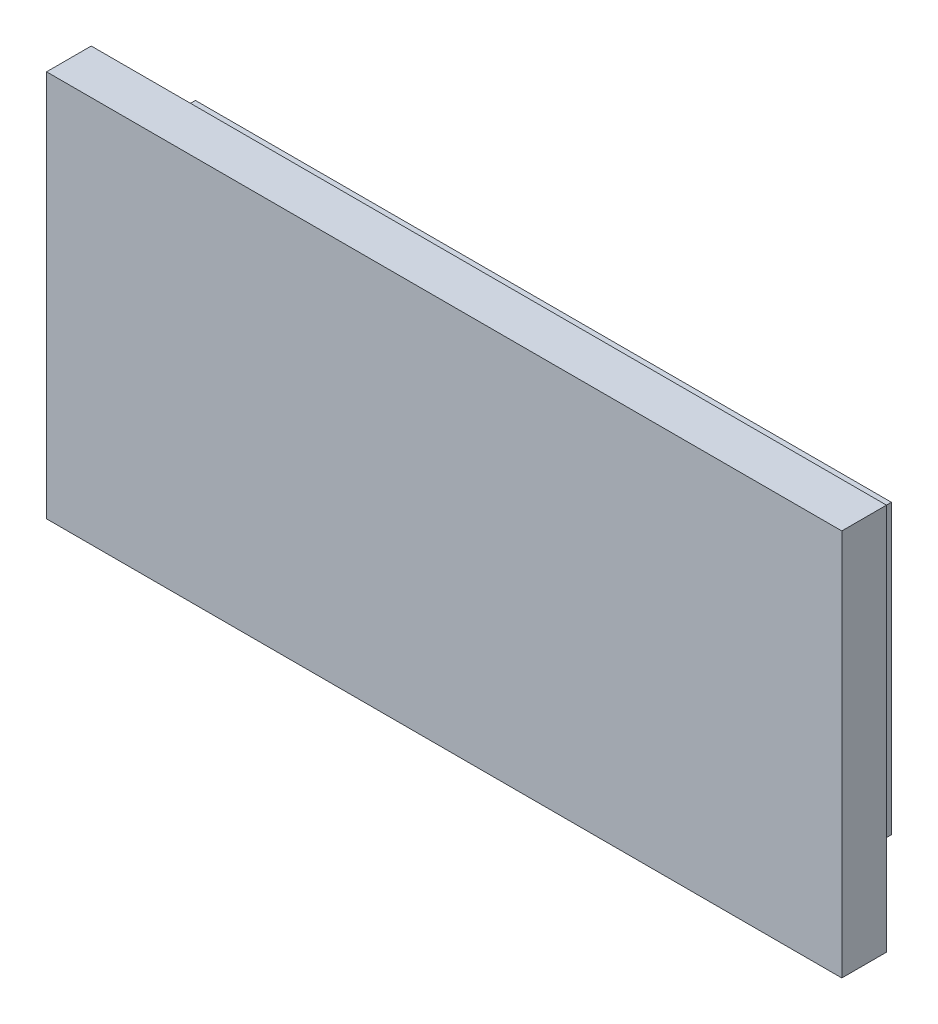
ISO-10303-21;
HEADER;
FILE_DESCRIPTION(('STEP AP214'),'2;1');
FILE_NAME('part.step','',(''),(''),'','','');
FILE_SCHEMA(('AUTOMOTIVE_DESIGN { 1 0 10303 214 1 1 1 1 }'));
ENDSEC;
DATA;
#1=APPLICATION_CONTEXT('core data for automotive mechanical design processes');
#2=APPLICATION_PROTOCOL_DEFINITION('international standard','automotive_design',2000,#1);
#3=PRODUCT_CONTEXT('',#1,'mechanical');
#4=PRODUCT('Part','Part','',(#3));
#5=PRODUCT_RELATED_PRODUCT_CATEGORY('part','',(#4));
#6=PRODUCT_DEFINITION_FORMATION('','',#4);
#7=PRODUCT_DEFINITION_CONTEXT('part definition',#1,'design');
#8=PRODUCT_DEFINITION('design','',#6,#7);
#9=PRODUCT_DEFINITION_SHAPE('','',#8);
#10=(LENGTH_UNIT() NAMED_UNIT(*) SI_UNIT(.MILLI.,.METRE.));
#11=(NAMED_UNIT(*) PLANE_ANGLE_UNIT() SI_UNIT($,.RADIAN.));
#12=(NAMED_UNIT(*) SI_UNIT($,.STERADIAN.) SOLID_ANGLE_UNIT());
#13=UNCERTAINTY_MEASURE_WITH_UNIT(LENGTH_MEASURE(1.E-05),#10,'distance_accuracy_value','');
#14=(GEOMETRIC_REPRESENTATION_CONTEXT(3) GLOBAL_UNCERTAINTY_ASSIGNED_CONTEXT((#13)) GLOBAL_UNIT_ASSIGNED_CONTEXT((#10,
#11,#12)) REPRESENTATION_CONTEXT('',''));
#15=CARTESIAN_POINT('',(0.,0.,0.));
#16=DIRECTION('',(0.,0.,1.));
#17=DIRECTION('',(1.,0.,0.));
#18=AXIS2_PLACEMENT_3D('',#15,#16,#17);
#19=CARTESIAN_POINT('',(-105.3879,0.,-0.9));
#20=DIRECTION('',(-1.,0.,0.));
#21=DIRECTION('',(0.,0.,1.));
#22=AXIS2_PLACEMENT_3D('',#19,#20,#21);
#23=PLANE('',#22);
#24=DIRECTION('',(0.,-1.,0.));
#25=VECTOR('',#24,1.);
#26=CARTESIAN_POINT('',(-105.3879,0.,0.));
#27=LINE('',#26,#25);
#28=CARTESIAN_POINT('',(-105.3879,-96.2518,0.));
#29=VERTEX_POINT('',#28);
#30=CARTESIAN_POINT('',(-105.3879,-104.0518,0.));
#31=VERTEX_POINT('',#30);
#32=EDGE_CURVE('E129',#29,#31,#27,.T.);
#33=ORIENTED_EDGE('',*,*,#32,.T.);
#34=DIRECTION('',(0.,0.,1.));
#35=VECTOR('',#34,1.);
#36=CARTESIAN_POINT('',(-105.3879,-104.0518,-0.9));
#37=LINE('',#36,#35);
#38=CARTESIAN_POINT('',(-105.3879,-104.0518,-0.9));
#39=VERTEX_POINT('',#38);
#40=EDGE_CURVE('E12',#39,#31,#37,.T.);
#41=ORIENTED_EDGE('',*,*,#40,.F.);
#42=DIRECTION('',(0.,-1.,0.));
#43=VECTOR('',#42,1.);
#44=CARTESIAN_POINT('',(-105.3879,0.,-0.9));
#45=LINE('',#44,#43);
#46=CARTESIAN_POINT('',(-105.3879,-96.2518,-0.9));
#47=VERTEX_POINT('',#46);
#48=EDGE_CURVE('E131',#47,#39,#45,.T.);
#49=ORIENTED_EDGE('',*,*,#48,.F.);
#50=DIRECTION('',(0.,0.,1.));
#51=VECTOR('',#50,1.);
#52=CARTESIAN_POINT('',(-105.3879,-96.2518,-0.9));
#53=LINE('',#52,#51);
#54=EDGE_CURVE('E39',#47,#29,#53,.T.);
#55=ORIENTED_EDGE('',*,*,#54,.T.);
#56=EDGE_LOOP('',(#33,#41,#49,#55));
#57=FACE_BOUND('',#56,.T.);
#58=ADVANCED_FACE('F36',(#57),#23,.F.);
#59=CARTESIAN_POINT('',(0.,-104.0518,-0.9));
#60=DIRECTION('',(0.,-1.,0.));
#61=DIRECTION('',(0.,0.,-1.));
#62=AXIS2_PLACEMENT_3D('',#59,#60,#61);
#63=PLANE('',#62);
#64=DIRECTION('',(1.,0.,0.));
#65=VECTOR('',#64,1.);
#66=CARTESIAN_POINT('',(0.,-104.0518,0.));
#67=LINE('',#66,#65);
#68=CARTESIAN_POINT('',(-121.4087,-104.0518,0.));
#69=VERTEX_POINT('',#68);
#70=EDGE_CURVE('E134',#69,#31,#67,.T.);
#71=ORIENTED_EDGE('',*,*,#70,.F.);
#72=DIRECTION('',(0.,0.,1.));
#73=VECTOR('',#72,1.);
#74=CARTESIAN_POINT('',(-121.4087,-104.0518,-0.9));
#75=LINE('',#74,#73);
#76=CARTESIAN_POINT('',(-121.4087,-104.0518,-0.9));
#77=VERTEX_POINT('',#76);
#78=EDGE_CURVE('E44',#77,#69,#75,.T.);
#79=ORIENTED_EDGE('',*,*,#78,.F.);
#80=DIRECTION('',(1.,0.,0.));
#81=VECTOR('',#80,1.);
#82=CARTESIAN_POINT('',(0.,-104.0518,-0.9));
#83=LINE('',#82,#81);
#84=EDGE_CURVE('E139',#77,#39,#83,.T.);
#85=ORIENTED_EDGE('',*,*,#84,.T.);
#86=ORIENTED_EDGE('',*,*,#40,.T.);
#87=EDGE_LOOP('',(#71,#79,#85,#86));
#88=FACE_BOUND('',#87,.T.);
#89=ADVANCED_FACE('F166',(#88),#63,.T.);
#90=CARTESIAN_POINT('',(-121.4087,0.,-0.9));
#91=DIRECTION('',(-1.,0.,0.));
#92=DIRECTION('',(0.,0.,1.));
#93=AXIS2_PLACEMENT_3D('',#90,#91,#92);
#94=PLANE('',#93);
#95=DIRECTION('',(0.,-1.,0.));
#96=VECTOR('',#95,1.);
#97=CARTESIAN_POINT('',(-121.4087,0.,0.));
#98=LINE('',#97,#96);
#99=CARTESIAN_POINT('',(-121.4087,-96.2518,0.));
#100=VERTEX_POINT('',#99);
#101=EDGE_CURVE('E146',#100,#69,#98,.T.);
#102=ORIENTED_EDGE('',*,*,#101,.F.);
#103=DIRECTION('',(0.,0.,1.));
#104=VECTOR('',#103,1.);
#105=CARTESIAN_POINT('',(-121.4087,-96.2518,-0.9));
#106=LINE('',#105,#104);
#107=CARTESIAN_POINT('',(-121.4087,-96.2518,-0.9));
#108=VERTEX_POINT('',#107);
#109=EDGE_CURVE('E151',#108,#100,#106,.T.);
#110=ORIENTED_EDGE('',*,*,#109,.F.);
#111=DIRECTION('',(0.,-1.,0.));
#112=VECTOR('',#111,1.);
#113=CARTESIAN_POINT('',(-121.4087,0.,-0.9));
#114=LINE('',#113,#112);
#115=EDGE_CURVE('E136',#108,#77,#114,.T.);
#116=ORIENTED_EDGE('',*,*,#115,.T.);
#117=ORIENTED_EDGE('',*,*,#78,.T.);
#118=EDGE_LOOP('',(#102,#110,#116,#117));
#119=FACE_BOUND('',#118,.T.);
#120=ADVANCED_FACE('F171',(#119),#94,.T.);
#121=CARTESIAN_POINT('',(0.,-96.2518,-0.9));
#122=DIRECTION('',(0.,-1.,0.));
#123=DIRECTION('',(0.,0.,-1.));
#124=AXIS2_PLACEMENT_3D('',#121,#122,#123);
#125=PLANE('',#124);
#126=DIRECTION('',(1.,0.,0.));
#127=VECTOR('',#126,1.);
#128=CARTESIAN_POINT('',(0.,-96.2518,0.));
#129=LINE('',#128,#127);
#130=EDGE_CURVE('E144',#100,#29,#129,.T.);
#131=ORIENTED_EDGE('',*,*,#130,.T.);
#132=ORIENTED_EDGE('',*,*,#54,.F.);
#133=DIRECTION('',(1.,0.,0.));
#134=VECTOR('',#133,1.);
#135=CARTESIAN_POINT('',(0.,-96.2518,-0.9));
#136=LINE('',#135,#134);
#137=EDGE_CURVE('E133',#108,#47,#136,.T.);
#138=ORIENTED_EDGE('',*,*,#137,.F.);
#139=ORIENTED_EDGE('',*,*,#109,.T.);
#140=EDGE_LOOP('',(#131,#132,#138,#139));
#141=FACE_BOUND('',#140,.T.);
#142=ADVANCED_FACE('F169',(#141),#125,.F.);
#143=CARTESIAN_POINT('',(0.,0.,-0.9));
#144=DIRECTION('',(0.,0.,1.));
#145=DIRECTION('',(1.,0.,0.));
#146=AXIS2_PLACEMENT_3D('',#143,#144,#145);
#147=PLANE('',#146);
#148=DIRECTION('',(1.,0.,0.));
#149=VECTOR('',#148,1.);
#150=CARTESIAN_POINT('',(0.,-97.2518,-0.9));
#151=LINE('',#150,#149);
#152=CARTESIAN_POINT('',(-120.4087,-97.2518,-0.9));
#153=VERTEX_POINT('',#152);
#154=CARTESIAN_POINT('',(-106.3879,-97.2518,-0.9));
#155=VERTEX_POINT('',#154);
#156=EDGE_CURVE('E103',#153,#155,#151,.T.);
#157=ORIENTED_EDGE('',*,*,#156,.F.);
#158=DIRECTION('',(0.,-1.,0.));
#159=VECTOR('',#158,1.);
#160=CARTESIAN_POINT('',(-120.4087,0.,-0.9));
#161=LINE('',#160,#159);
#162=CARTESIAN_POINT('',(-120.4087,-103.0518,-0.9));
#163=VERTEX_POINT('',#162);
#164=EDGE_CURVE('E52',#153,#163,#161,.T.);
#165=ORIENTED_EDGE('',*,*,#164,.T.);
#166=DIRECTION('',(1.,0.,0.));
#167=VECTOR('',#166,1.);
#168=CARTESIAN_POINT('',(0.,-103.0518,-0.9));
#169=LINE('',#168,#167);
#170=CARTESIAN_POINT('',(-106.3879,-103.0518,-0.9));
#171=VERTEX_POINT('',#170);
#172=EDGE_CURVE('E57',#163,#171,#169,.T.);
#173=ORIENTED_EDGE('',*,*,#172,.T.);
#174=DIRECTION('',(0.,-1.,0.));
#175=VECTOR('',#174,1.);
#176=CARTESIAN_POINT('',(-106.3879,0.,-0.9));
#177=LINE('',#176,#175);
#178=EDGE_CURVE('E98',#155,#171,#177,.T.);
#179=ORIENTED_EDGE('',*,*,#178,.F.);
#180=EDGE_LOOP('',(#157,#165,#173,#179));
#181=FACE_BOUND('',#180,.T.);
#182=ORIENTED_EDGE('',*,*,#48,.T.);
#183=ORIENTED_EDGE('',*,*,#84,.F.);
#184=ORIENTED_EDGE('',*,*,#115,.F.);
#185=ORIENTED_EDGE('',*,*,#137,.T.);
#186=EDGE_LOOP('',(#182,#183,#184,#185));
#187=FACE_BOUND('',#186,.T.);
#188=ADVANCED_FACE('F100',(#181,#187),#147,.F.);
#189=CARTESIAN_POINT('',(0.,0.,0.));
#190=DIRECTION('',(0.,0.,1.));
#191=DIRECTION('',(1.,0.,0.));
#192=AXIS2_PLACEMENT_3D('',#189,#190,#191);
#193=PLANE('',#192);
#194=ORIENTED_EDGE('',*,*,#32,.F.);
#195=ORIENTED_EDGE('',*,*,#130,.F.);
#196=ORIENTED_EDGE('',*,*,#101,.T.);
#197=ORIENTED_EDGE('',*,*,#70,.T.);
#198=EDGE_LOOP('',(#194,#195,#196,#197));
#199=FACE_BOUND('',#198,.T.);
#200=ADVANCED_FACE('F162',(#199),#193,.T.);
#201=CARTESIAN_POINT('',(-120.4087,0.,-27.1730956841377));
#202=DIRECTION('',(-1.,0.,0.));
#203=DIRECTION('',(0.,0.,1.));
#204=AXIS2_PLACEMENT_3D('',#201,#202,#203);
#205=PLANE('',#204);
#206=DIRECTION('',(0.,1.,0.));
#207=VECTOR('',#206,1.);
#208=CARTESIAN_POINT('',(-120.4087,0.,-2.));
#209=LINE('',#208,#207);
#210=CARTESIAN_POINT('',(-120.4087,-103.0518,-2.));
#211=VERTEX_POINT('',#210);
#212=CARTESIAN_POINT('',(-120.4087,-97.2518,-2.));
#213=VERTEX_POINT('',#212);
#214=EDGE_CURVE('E130',#211,#213,#209,.T.);
#215=ORIENTED_EDGE('',*,*,#214,.F.);
#216=DIRECTION('',(0.,0.,1.));
#217=VECTOR('',#216,1.);
#218=CARTESIAN_POINT('',(-120.4087,-103.0518,-27.1730956841377));
#219=LINE('',#218,#217);
#220=EDGE_CURVE('E120',#211,#163,#219,.T.);
#221=ORIENTED_EDGE('',*,*,#220,.T.);
#222=ORIENTED_EDGE('',*,*,#164,.F.);
#223=DIRECTION('',(0.,0.,1.));
#224=VECTOR('',#223,1.);
#225=CARTESIAN_POINT('',(-120.4087,-97.2518,-27.1730956841377));
#226=LINE('',#225,#224);
#227=EDGE_CURVE('E115',#213,#153,#226,.T.);
#228=ORIENTED_EDGE('',*,*,#227,.F.);
#229=EDGE_LOOP('',(#215,#221,#222,#228));
#230=FACE_BOUND('',#229,.T.);
#231=ADVANCED_FACE('F188',(#230),#205,.T.);
#232=CARTESIAN_POINT('',(0.,-97.2518,-27.1730956841377));
#233=DIRECTION('',(0.,-1.,0.));
#234=DIRECTION('',(0.,0.,-1.));
#235=AXIS2_PLACEMENT_3D('',#232,#233,#234);
#236=PLANE('',#235);
#237=DIRECTION('',(0.,0.,1.));
#238=VECTOR('',#237,1.);
#239=CARTESIAN_POINT('',(-106.3879,-97.2518,-27.1730956841377));
#240=LINE('',#239,#238);
#241=CARTESIAN_POINT('',(-106.3879,-97.2518,-2.));
#242=VERTEX_POINT('',#241);
#243=EDGE_CURVE('E110',#242,#155,#240,.T.);
#244=ORIENTED_EDGE('',*,*,#243,.F.);
#245=DIRECTION('',(-1.,0.,0.));
#246=VECTOR('',#245,1.);
#247=CARTESIAN_POINT('',(0.,-97.2518,-2.));
#248=LINE('',#247,#246);
#249=EDGE_CURVE('E207',#242,#213,#248,.T.);
#250=ORIENTED_EDGE('',*,*,#249,.T.);
#251=ORIENTED_EDGE('',*,*,#227,.T.);
#252=ORIENTED_EDGE('',*,*,#156,.T.);
#253=EDGE_LOOP('',(#244,#250,#251,#252));
#254=FACE_BOUND('',#253,.T.);
#255=ADVANCED_FACE('F118',(#254),#236,.F.);
#256=CARTESIAN_POINT('',(-106.3879,0.,-27.1730956841377));
#257=DIRECTION('',(-1.,0.,0.));
#258=DIRECTION('',(0.,0.,1.));
#259=AXIS2_PLACEMENT_3D('',#256,#257,#258);
#260=PLANE('',#259);
#261=DIRECTION('',(0.,0.,1.));
#262=VECTOR('',#261,1.);
#263=CARTESIAN_POINT('',(-106.3879,-103.0518,-27.1730956841377));
#264=LINE('',#263,#262);
#265=CARTESIAN_POINT('',(-106.3879,-103.0518,-2.));
#266=VERTEX_POINT('',#265);
#267=EDGE_CURVE('E116',#266,#171,#264,.T.);
#268=ORIENTED_EDGE('',*,*,#267,.F.);
#269=DIRECTION('',(0.,1.,0.));
#270=VECTOR('',#269,1.);
#271=CARTESIAN_POINT('',(-106.3879,0.,-2.));
#272=LINE('',#271,#270);
#273=EDGE_CURVE('E112',#266,#242,#272,.T.);
#274=ORIENTED_EDGE('',*,*,#273,.T.);
#275=ORIENTED_EDGE('',*,*,#243,.T.);
#276=ORIENTED_EDGE('',*,*,#178,.T.);
#277=EDGE_LOOP('',(#268,#274,#275,#276));
#278=FACE_BOUND('',#277,.T.);
#279=ADVANCED_FACE('F111',(#278),#260,.F.);
#280=CARTESIAN_POINT('',(0.,-103.0518,-27.1730956841377));
#281=DIRECTION('',(0.,-1.,0.));
#282=DIRECTION('',(0.,0.,-1.));
#283=AXIS2_PLACEMENT_3D('',#280,#281,#282);
#284=PLANE('',#283);
#285=DIRECTION('',(-1.,0.,0.));
#286=VECTOR('',#285,1.);
#287=CARTESIAN_POINT('',(0.,-103.0518,-2.));
#288=LINE('',#287,#286);
#289=EDGE_CURVE('E127',#266,#211,#288,.T.);
#290=ORIENTED_EDGE('',*,*,#289,.F.);
#291=ORIENTED_EDGE('',*,*,#267,.T.);
#292=ORIENTED_EDGE('',*,*,#172,.F.);
#293=ORIENTED_EDGE('',*,*,#220,.F.);
#294=EDGE_LOOP('',(#290,#291,#292,#293));
#295=FACE_BOUND('',#294,.T.);
#296=ADVANCED_FACE('F193',(#295),#284,.T.);
#297=CARTESIAN_POINT('',(-147.6248,-119.6463,-2.));
#298=DIRECTION('',(0.,0.,1.));
#299=DIRECTION('',(0.,-1.,0.));
#300=AXIS2_PLACEMENT_3D('',#297,#298,#299);
#301=PLANE('',#300);
#302=ORIENTED_EDGE('',*,*,#214,.T.);
#303=ORIENTED_EDGE('',*,*,#249,.F.);
#304=ORIENTED_EDGE('',*,*,#273,.F.);
#305=ORIENTED_EDGE('',*,*,#289,.T.);
#306=EDGE_LOOP('',(#302,#303,#304,#305));
#307=FACE_BOUND('',#306,.T.);
#308=ADVANCED_FACE('F196',(#307),#301,.F.);
#309=CLOSED_SHELL('',(#58,#89,#120,#142,#188,#200,#231,#255,#279,#296,#308));
#310=MANIFOLD_SOLID_BREP('B2',#309);
#311=ADVANCED_BREP_SHAPE_REPRESENTATION('',(#18,#310),#14);
#312=SHAPE_DEFINITION_REPRESENTATION(#9,#311);
ENDSEC;
END-ISO-10303-21;
